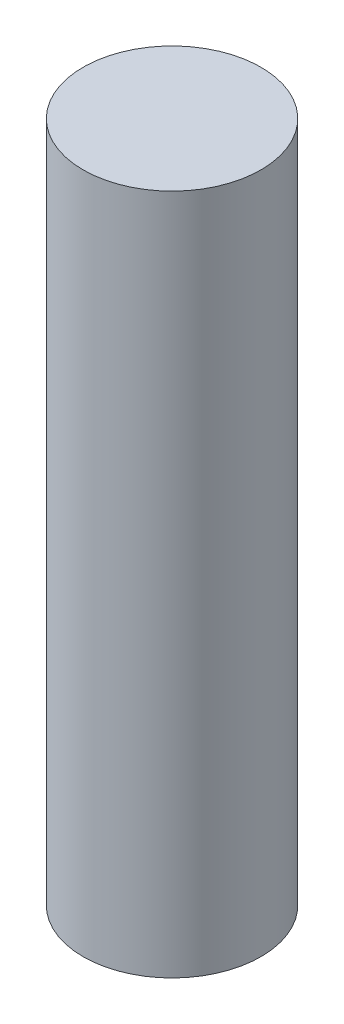
ISO-10303-21;
HEADER;
FILE_DESCRIPTION(('STEP AP214'),'2;1');
FILE_NAME('part.step','',(''),(''),'','','');
FILE_SCHEMA(('AUTOMOTIVE_DESIGN { 1 0 10303 214 1 1 1 1 }'));
ENDSEC;
DATA;
#1=APPLICATION_CONTEXT('core data for automotive mechanical design processes');
#2=APPLICATION_PROTOCOL_DEFINITION('international standard','automotive_design',2000,#1);
#3=PRODUCT_CONTEXT('',#1,'mechanical');
#4=PRODUCT('Part','Part','',(#3));
#5=PRODUCT_RELATED_PRODUCT_CATEGORY('part','',(#4));
#6=PRODUCT_DEFINITION_FORMATION('','',#4);
#7=PRODUCT_DEFINITION_CONTEXT('part definition',#1,'design');
#8=PRODUCT_DEFINITION('design','',#6,#7);
#9=PRODUCT_DEFINITION_SHAPE('','',#8);
#10=(LENGTH_UNIT() NAMED_UNIT(*) SI_UNIT(.MILLI.,.METRE.));
#11=(NAMED_UNIT(*) PLANE_ANGLE_UNIT() SI_UNIT($,.RADIAN.));
#12=(NAMED_UNIT(*) SI_UNIT($,.STERADIAN.) SOLID_ANGLE_UNIT());
#13=UNCERTAINTY_MEASURE_WITH_UNIT(LENGTH_MEASURE(1.E-05),#10,'distance_accuracy_value','');
#14=(GEOMETRIC_REPRESENTATION_CONTEXT(3) GLOBAL_UNCERTAINTY_ASSIGNED_CONTEXT((#13)) GLOBAL_UNIT_ASSIGNED_CONTEXT((#10,
#11,#12)) REPRESENTATION_CONTEXT('',''));
#15=CARTESIAN_POINT('',(0.,0.,0.));
#16=DIRECTION('',(0.,0.,1.));
#17=DIRECTION('',(1.,0.,0.));
#18=AXIS2_PLACEMENT_3D('',#15,#16,#17);
#19=CARTESIAN_POINT('',(0.,14.75,-45.445));
#20=DIRECTION('',(0.,-1.,0.));
#21=DIRECTION('',(0.,0.,-1.));
#22=AXIS2_PLACEMENT_3D('',#19,#20,#21);
#23=CYLINDRICAL_SURFACE('',#22,1.925);
#24=CARTESIAN_POINT('',(0.,14.75,-45.445));
#25=DIRECTION('',(0.,1.,0.));
#26=DIRECTION('',(0.,0.,1.));
#27=AXIS2_PLACEMENT_3D('',#24,#25,#26);
#28=CIRCLE('',#27,1.925);
#29=CARTESIAN_POINT('',(0.,14.75,-43.52));
#30=VERTEX_POINT('',#29);
#31=EDGE_CURVE('E10',#30,#30,#28,.T.);
#32=ORIENTED_EDGE('',*,*,#31,.F.);
#33=EDGE_LOOP('',(#32));
#34=FACE_BOUND('',#33,.T.);
#35=CARTESIAN_POINT('',(0.,0.,-45.445));
#36=DIRECTION('',(0.,1.,0.));
#37=DIRECTION('',(0.,0.,1.));
#38=AXIS2_PLACEMENT_3D('',#35,#36,#37);
#39=CIRCLE('',#38,1.925);
#40=CARTESIAN_POINT('',(0.,0.,-43.52));
#41=VERTEX_POINT('',#40);
#42=EDGE_CURVE('E40',#41,#41,#39,.T.);
#43=ORIENTED_EDGE('',*,*,#42,.T.);
#44=EDGE_LOOP('',(#43));
#45=FACE_BOUND('',#44,.T.);
#46=ADVANCED_FACE('F37',(#34,#45),#23,.T.);
#47=CARTESIAN_POINT('',(0.,14.75,-45.445));
#48=DIRECTION('',(0.,1.,0.));
#49=DIRECTION('',(0.,0.,1.));
#50=AXIS2_PLACEMENT_3D('',#47,#48,#49);
#51=PLANE('',#50);
#52=ORIENTED_EDGE('',*,*,#31,.T.);
#53=EDGE_LOOP('',(#52));
#54=FACE_BOUND('',#53,.T.);
#55=ADVANCED_FACE('F52',(#54),#51,.T.);
#56=CARTESIAN_POINT('',(0.,0.,-45.445));
#57=DIRECTION('',(0.,1.,0.));
#58=DIRECTION('',(0.,0.,1.));
#59=AXIS2_PLACEMENT_3D('',#56,#57,#58);
#60=PLANE('',#59);
#61=ORIENTED_EDGE('',*,*,#42,.F.);
#62=EDGE_LOOP('',(#61));
#63=FACE_BOUND('',#62,.T.);
#64=ADVANCED_FACE('F50',(#63),#60,.F.);
#65=CLOSED_SHELL('',(#46,#55,#64));
#66=MANIFOLD_SOLID_BREP('B2',#65);
#67=ADVANCED_BREP_SHAPE_REPRESENTATION('',(#18,#66),#14);
#68=SHAPE_DEFINITION_REPRESENTATION(#9,#67);
ENDSEC;
END-ISO-10303-21;
